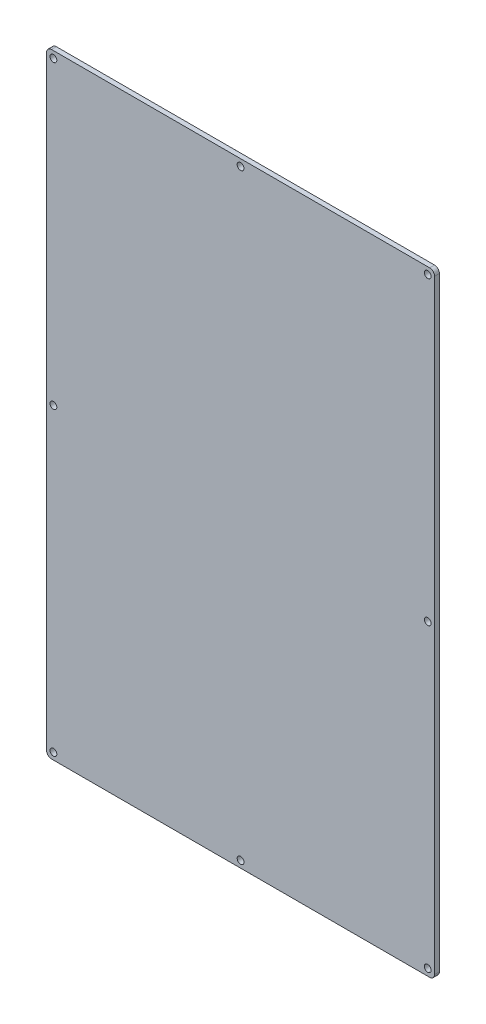
ISO-10303-21;
HEADER;
FILE_DESCRIPTION(('STEP AP214'),'2;1');
FILE_NAME('part.step','',(''),(''),'','','');
FILE_SCHEMA(('AUTOMOTIVE_DESIGN { 1 0 10303 214 1 1 1 1 }'));
ENDSEC;
DATA;
#1=APPLICATION_CONTEXT('core data for automotive mechanical design processes');
#2=APPLICATION_PROTOCOL_DEFINITION('international standard','automotive_design',2000,#1);
#3=PRODUCT_CONTEXT('',#1,'mechanical');
#4=PRODUCT('Part','Part','',(#3));
#5=PRODUCT_RELATED_PRODUCT_CATEGORY('part','',(#4));
#6=PRODUCT_DEFINITION_FORMATION('','',#4);
#7=PRODUCT_DEFINITION_CONTEXT('part definition',#1,'design');
#8=PRODUCT_DEFINITION('design','',#6,#7);
#9=PRODUCT_DEFINITION_SHAPE('','',#8);
#10=(LENGTH_UNIT() NAMED_UNIT(*) SI_UNIT(.MILLI.,.METRE.));
#11=(NAMED_UNIT(*) PLANE_ANGLE_UNIT() SI_UNIT($,.RADIAN.));
#12=(NAMED_UNIT(*) SI_UNIT($,.STERADIAN.) SOLID_ANGLE_UNIT());
#13=UNCERTAINTY_MEASURE_WITH_UNIT(LENGTH_MEASURE(1.E-05),#10,'distance_accuracy_value','');
#14=(GEOMETRIC_REPRESENTATION_CONTEXT(3) GLOBAL_UNCERTAINTY_ASSIGNED_CONTEXT((#13)) GLOBAL_UNIT_ASSIGNED_CONTEXT((#10,
#11,#12)) REPRESENTATION_CONTEXT('',''));
#15=CARTESIAN_POINT('',(0.,0.,0.));
#16=DIRECTION('',(0.,0.,1.));
#17=DIRECTION('',(1.,0.,0.));
#18=AXIS2_PLACEMENT_3D('',#15,#16,#17);
#19=CARTESIAN_POINT('',(0.,0.,2.5));
#20=DIRECTION('',(0.,0.,1.));
#21=DIRECTION('',(1.,0.,0.));
#22=AXIS2_PLACEMENT_3D('',#19,#20,#21);
#23=PLANE('',#22);
#24=CARTESIAN_POINT('',(-192.5,0.,2.5));
#25=DIRECTION('',(0.,0.,1.));
#26=DIRECTION('',(1.,0.,0.));
#27=AXIS2_PLACEMENT_3D('',#24,#25,#26);
#28=CIRCLE('',#27,3.5);
#29=CARTESIAN_POINT('',(-189.,0.,2.5));
#30=VERTEX_POINT('',#29);
#31=EDGE_CURVE('E178',#30,#30,#28,.F.);
#32=ORIENTED_EDGE('',*,*,#31,.T.);
#33=EDGE_LOOP('',(#32));
#34=FACE_BOUND('',#33,.T.);
#35=CARTESIAN_POINT('',(-192.5,-309.,2.5));
#36=DIRECTION('',(0.,0.,1.));
#37=DIRECTION('',(1.,0.,0.));
#38=AXIS2_PLACEMENT_3D('',#35,#36,#37);
#39=CIRCLE('',#38,3.5);
#40=CARTESIAN_POINT('',(-189.,-309.,2.5));
#41=VERTEX_POINT('',#40);
#42=EDGE_CURVE('E180',#41,#41,#39,.F.);
#43=ORIENTED_EDGE('',*,*,#42,.T.);
#44=EDGE_LOOP('',(#43));
#45=FACE_BOUND('',#44,.T.);
#46=CARTESIAN_POINT('',(0.,-309.,2.5));
#47=DIRECTION('',(0.,0.,1.));
#48=DIRECTION('',(1.,0.,0.));
#49=AXIS2_PLACEMENT_3D('',#46,#47,#48);
#50=CIRCLE('',#49,3.49999999999997);
#51=CARTESIAN_POINT('',(3.49999999999999,-309.,2.5));
#52=VERTEX_POINT('',#51);
#53=EDGE_CURVE('E209',#52,#52,#50,.F.);
#54=ORIENTED_EDGE('',*,*,#53,.T.);
#55=EDGE_LOOP('',(#54));
#56=FACE_BOUND('',#55,.T.);
#57=CARTESIAN_POINT('',(192.5,-309.,2.5));
#58=DIRECTION('',(0.,0.,1.));
#59=DIRECTION('',(1.,0.,0.));
#60=AXIS2_PLACEMENT_3D('',#57,#58,#59);
#61=CIRCLE('',#60,3.5);
#62=CARTESIAN_POINT('',(196.,-309.,2.5));
#63=VERTEX_POINT('',#62);
#64=EDGE_CURVE('E203',#63,#63,#61,.F.);
#65=ORIENTED_EDGE('',*,*,#64,.T.);
#66=EDGE_LOOP('',(#65));
#67=FACE_BOUND('',#66,.T.);
#68=CARTESIAN_POINT('',(192.5,0.,2.5));
#69=DIRECTION('',(0.,0.,1.));
#70=DIRECTION('',(1.,0.,0.));
#71=AXIS2_PLACEMENT_3D('',#68,#69,#70);
#72=CIRCLE('',#71,3.5);
#73=CARTESIAN_POINT('',(196.,0.,2.5));
#74=VERTEX_POINT('',#73);
#75=EDGE_CURVE('E197',#74,#74,#72,.F.);
#76=ORIENTED_EDGE('',*,*,#75,.T.);
#77=EDGE_LOOP('',(#76));
#78=FACE_BOUND('',#77,.T.);
#79=CARTESIAN_POINT('',(192.5,309.,2.5));
#80=DIRECTION('',(0.,0.,1.));
#81=DIRECTION('',(1.,0.,0.));
#82=AXIS2_PLACEMENT_3D('',#79,#80,#81);
#83=CIRCLE('',#82,3.5);
#84=CARTESIAN_POINT('',(196.,309.,2.5));
#85=VERTEX_POINT('',#84);
#86=EDGE_CURVE('E191',#85,#85,#83,.F.);
#87=ORIENTED_EDGE('',*,*,#86,.T.);
#88=EDGE_LOOP('',(#87));
#89=FACE_BOUND('',#88,.T.);
#90=CARTESIAN_POINT('',(0.,309.,2.5));
#91=DIRECTION('',(0.,0.,1.));
#92=DIRECTION('',(1.,0.,0.));
#93=AXIS2_PLACEMENT_3D('',#90,#91,#92);
#94=CIRCLE('',#93,3.49999999999997);
#95=CARTESIAN_POINT('',(3.49999999999999,309.,2.5));
#96=VERTEX_POINT('',#95);
#97=EDGE_CURVE('E185',#96,#96,#94,.F.);
#98=ORIENTED_EDGE('',*,*,#97,.T.);
#99=EDGE_LOOP('',(#98));
#100=FACE_BOUND('',#99,.T.);
#101=CARTESIAN_POINT('',(-192.5,309.,2.5));
#102=DIRECTION('',(0.,0.,1.));
#103=DIRECTION('',(1.,0.,0.));
#104=AXIS2_PLACEMENT_3D('',#101,#102,#103);
#105=CIRCLE('',#104,3.5);
#106=CARTESIAN_POINT('',(-189.,309.,2.5));
#107=VERTEX_POINT('',#106);
#108=EDGE_CURVE('E182',#107,#107,#105,.F.);
#109=ORIENTED_EDGE('',*,*,#108,.T.);
#110=EDGE_LOOP('',(#109));
#111=FACE_BOUND('',#110,.T.);
#112=DIRECTION('',(0.,1.,0.));
#113=VECTOR('',#112,1.);
#114=CARTESIAN_POINT('',(-199.5,316.,2.5));
#115=LINE('',#114,#113);
#116=CARTESIAN_POINT('',(-199.5,311.,2.5));
#117=VERTEX_POINT('',#116);
#118=CARTESIAN_POINT('',(-199.5,-311.,2.5));
#119=VERTEX_POINT('',#118);
#120=EDGE_CURVE('E131',#117,#119,#115,.F.);
#121=ORIENTED_EDGE('',*,*,#120,.T.);
#122=CARTESIAN_POINT('',(-194.5,-311.,2.5));
#123=DIRECTION('',(0.,0.,-1.));
#124=DIRECTION('',(-1.,0.,0.));
#125=AXIS2_PLACEMENT_3D('',#122,#123,#124);
#126=CIRCLE('',#125,5.);
#127=CARTESIAN_POINT('',(-194.5,-316.,2.5));
#128=VERTEX_POINT('',#127);
#129=EDGE_CURVE('E120',#128,#119,#126,.T.);
#130=ORIENTED_EDGE('',*,*,#129,.F.);
#131=DIRECTION('',(1.,0.,0.));
#132=VECTOR('',#131,1.);
#133=CARTESIAN_POINT('',(-199.5,-316.,2.5));
#134=LINE('',#133,#132);
#135=CARTESIAN_POINT('',(194.5,-316.,2.5));
#136=VERTEX_POINT('',#135);
#137=EDGE_CURVE('E144',#128,#136,#134,.T.);
#138=ORIENTED_EDGE('',*,*,#137,.T.);
#139=CARTESIAN_POINT('',(194.5,-311.,2.5));
#140=DIRECTION('',(0.,0.,-1.));
#141=DIRECTION('',(-1.,0.,0.));
#142=AXIS2_PLACEMENT_3D('',#139,#140,#141);
#143=CIRCLE('',#142,5.);
#144=CARTESIAN_POINT('',(199.5,-311.,2.5));
#145=VERTEX_POINT('',#144);
#146=EDGE_CURVE('E158',#145,#136,#143,.T.);
#147=ORIENTED_EDGE('',*,*,#146,.F.);
#148=DIRECTION('',(0.,-1.,0.));
#149=VECTOR('',#148,1.);
#150=CARTESIAN_POINT('',(199.5,316.,2.5));
#151=LINE('',#150,#149);
#152=CARTESIAN_POINT('',(199.5,311.,2.5));
#153=VERTEX_POINT('',#152);
#154=EDGE_CURVE('E152',#145,#153,#151,.F.);
#155=ORIENTED_EDGE('',*,*,#154,.T.);
#156=CARTESIAN_POINT('',(194.5,311.,2.5));
#157=DIRECTION('',(0.,0.,-1.));
#158=DIRECTION('',(-1.,0.,0.));
#159=AXIS2_PLACEMENT_3D('',#156,#157,#158);
#160=CIRCLE('',#159,5.);
#161=CARTESIAN_POINT('',(194.5,316.,2.5));
#162=VERTEX_POINT('',#161);
#163=EDGE_CURVE('E155',#162,#153,#160,.T.);
#164=ORIENTED_EDGE('',*,*,#163,.F.);
#165=DIRECTION('',(1.,0.,0.));
#166=VECTOR('',#165,1.);
#167=CARTESIAN_POINT('',(-199.5,316.,2.5));
#168=LINE('',#167,#166);
#169=CARTESIAN_POINT('',(-194.5,316.,2.5));
#170=VERTEX_POINT('',#169);
#171=EDGE_CURVE('E148',#162,#170,#168,.F.);
#172=ORIENTED_EDGE('',*,*,#171,.T.);
#173=CARTESIAN_POINT('',(-194.5,311.,2.5));
#174=DIRECTION('',(0.,0.,-1.));
#175=DIRECTION('',(-1.,0.,0.));
#176=AXIS2_PLACEMENT_3D('',#173,#174,#175);
#177=CIRCLE('',#176,5.);
#178=EDGE_CURVE('E135',#117,#170,#177,.T.);
#179=ORIENTED_EDGE('',*,*,#178,.F.);
#180=EDGE_LOOP('',(#121,#130,#138,#147,#155,#164,#172,#179));
#181=FACE_BOUND('',#180,.T.);
#182=ADVANCED_FACE('F44',(#34,#45,#56,#67,#78,#89,#100,#111,#181),#23,.T.);
#183=CARTESIAN_POINT('',(-199.5,316.,2.5));
#184=DIRECTION('',(1.,0.,0.));
#185=DIRECTION('',(0.,1.,0.));
#186=AXIS2_PLACEMENT_3D('',#183,#184,#185);
#187=PLANE('',#186);
#188=DIRECTION('',(0.,1.,0.));
#189=VECTOR('',#188,1.);
#190=CARTESIAN_POINT('',(-199.5,0.,-2.5));
#191=LINE('',#190,#189);
#192=CARTESIAN_POINT('',(-199.5,311.,-2.5));
#193=VERTEX_POINT('',#192);
#194=CARTESIAN_POINT('',(-199.5,-311.,-2.5));
#195=VERTEX_POINT('',#194);
#196=EDGE_CURVE('E142',#193,#195,#191,.F.);
#197=ORIENTED_EDGE('',*,*,#196,.T.);
#198=DIRECTION('',(0.,0.,-1.));
#199=VECTOR('',#198,1.);
#200=CARTESIAN_POINT('',(-199.5,-311.,2.5));
#201=LINE('',#200,#199);
#202=EDGE_CURVE('E128',#119,#195,#201,.T.);
#203=ORIENTED_EDGE('',*,*,#202,.F.);
#204=ORIENTED_EDGE('',*,*,#120,.F.);
#205=DIRECTION('',(0.,0.,-1.));
#206=VECTOR('',#205,1.);
#207=CARTESIAN_POINT('',(-199.5,311.,2.5));
#208=LINE('',#207,#206);
#209=EDGE_CURVE('E149',#193,#117,#208,.F.);
#210=ORIENTED_EDGE('',*,*,#209,.F.);
#211=EDGE_LOOP('',(#197,#203,#204,#210));
#212=FACE_BOUND('',#211,.T.);
#213=ADVANCED_FACE('F141',(#212),#187,.F.);
#214=CARTESIAN_POINT('',(-194.5,-311.,2.5));
#215=DIRECTION('',(0.,0.,-1.));
#216=DIRECTION('',(-1.,0.,0.));
#217=AXIS2_PLACEMENT_3D('',#214,#215,#216);
#218=CYLINDRICAL_SURFACE('',#217,5.);
#219=ORIENTED_EDGE('',*,*,#129,.T.);
#220=ORIENTED_EDGE('',*,*,#202,.T.);
#221=CARTESIAN_POINT('',(-194.5,-311.,-2.5));
#222=DIRECTION('',(0.,0.,-1.));
#223=DIRECTION('',(-1.,0.,0.));
#224=AXIS2_PLACEMENT_3D('',#221,#222,#223);
#225=CIRCLE('',#224,5.);
#226=CARTESIAN_POINT('',(-194.5,-316.,-2.5));
#227=VERTEX_POINT('',#226);
#228=EDGE_CURVE('E171',#195,#227,#225,.F.);
#229=ORIENTED_EDGE('',*,*,#228,.T.);
#230=DIRECTION('',(0.,0.,1.));
#231=VECTOR('',#230,1.);
#232=CARTESIAN_POINT('',(-194.5,-316.,2.5));
#233=LINE('',#232,#231);
#234=EDGE_CURVE('E130',#227,#128,#233,.T.);
#235=ORIENTED_EDGE('',*,*,#234,.T.);
#236=EDGE_LOOP('',(#219,#220,#229,#235));
#237=FACE_BOUND('',#236,.T.);
#238=ADVANCED_FACE('F125',(#237),#218,.T.);
#239=CARTESIAN_POINT('',(-199.5,-316.,2.5));
#240=DIRECTION('',(0.,1.,0.));
#241=DIRECTION('',(0.,0.,1.));
#242=AXIS2_PLACEMENT_3D('',#239,#240,#241);
#243=PLANE('',#242);
#244=ORIENTED_EDGE('',*,*,#137,.F.);
#245=ORIENTED_EDGE('',*,*,#234,.F.);
#246=DIRECTION('',(1.,0.,0.));
#247=VECTOR('',#246,1.);
#248=CARTESIAN_POINT('',(0.,-316.,-2.5));
#249=LINE('',#248,#247);
#250=CARTESIAN_POINT('',(194.5,-316.,-2.5));
#251=VERTEX_POINT('',#250);
#252=EDGE_CURVE('E170',#227,#251,#249,.T.);
#253=ORIENTED_EDGE('',*,*,#252,.T.);
#254=DIRECTION('',(0.,0.,-1.));
#255=VECTOR('',#254,1.);
#256=CARTESIAN_POINT('',(194.5,-316.,2.5));
#257=LINE('',#256,#255);
#258=EDGE_CURVE('E176',#136,#251,#257,.T.);
#259=ORIENTED_EDGE('',*,*,#258,.F.);
#260=EDGE_LOOP('',(#244,#245,#253,#259));
#261=FACE_BOUND('',#260,.T.);
#262=ADVANCED_FACE('F272',(#261),#243,.F.);
#263=CARTESIAN_POINT('',(194.5,-311.,2.5));
#264=DIRECTION('',(0.,0.,-1.));
#265=DIRECTION('',(-1.,0.,0.));
#266=AXIS2_PLACEMENT_3D('',#263,#264,#265);
#267=CYLINDRICAL_SURFACE('',#266,5.);
#268=ORIENTED_EDGE('',*,*,#146,.T.);
#269=ORIENTED_EDGE('',*,*,#258,.T.);
#270=CARTESIAN_POINT('',(194.5,-311.,-2.5));
#271=DIRECTION('',(0.,0.,-1.));
#272=DIRECTION('',(-1.,0.,0.));
#273=AXIS2_PLACEMENT_3D('',#270,#271,#272);
#274=CIRCLE('',#273,5.);
#275=CARTESIAN_POINT('',(199.5,-311.,-2.5));
#276=VERTEX_POINT('',#275);
#277=EDGE_CURVE('E167',#251,#276,#274,.F.);
#278=ORIENTED_EDGE('',*,*,#277,.T.);
#279=DIRECTION('',(0.,0.,1.));
#280=VECTOR('',#279,1.);
#281=CARTESIAN_POINT('',(199.5,-311.,2.5));
#282=LINE('',#281,#280);
#283=EDGE_CURVE('E156',#276,#145,#282,.T.);
#284=ORIENTED_EDGE('',*,*,#283,.T.);
#285=EDGE_LOOP('',(#268,#269,#278,#284));
#286=FACE_BOUND('',#285,.T.);
#287=ADVANCED_FACE('F268',(#286),#267,.T.);
#288=CARTESIAN_POINT('',(199.5,316.,2.5));
#289=DIRECTION('',(-1.,0.,0.));
#290=DIRECTION('',(0.,-1.,0.));
#291=AXIS2_PLACEMENT_3D('',#288,#289,#290);
#292=PLANE('',#291);
#293=ORIENTED_EDGE('',*,*,#154,.F.);
#294=ORIENTED_EDGE('',*,*,#283,.F.);
#295=DIRECTION('',(0.,1.,0.));
#296=VECTOR('',#295,1.);
#297=CARTESIAN_POINT('',(199.5,0.,-2.5));
#298=LINE('',#297,#296);
#299=CARTESIAN_POINT('',(199.5,311.,-2.5));
#300=VERTEX_POINT('',#299);
#301=EDGE_CURVE('E166',#276,#300,#298,.T.);
#302=ORIENTED_EDGE('',*,*,#301,.T.);
#303=DIRECTION('',(0.,0.,-1.));
#304=VECTOR('',#303,1.);
#305=CARTESIAN_POINT('',(199.5,311.,2.5));
#306=LINE('',#305,#304);
#307=EDGE_CURVE('E175',#153,#300,#306,.T.);
#308=ORIENTED_EDGE('',*,*,#307,.F.);
#309=EDGE_LOOP('',(#293,#294,#302,#308));
#310=FACE_BOUND('',#309,.T.);
#311=ADVANCED_FACE('F287',(#310),#292,.F.);
#312=CARTESIAN_POINT('',(194.5,311.,2.5));
#313=DIRECTION('',(0.,0.,-1.));
#314=DIRECTION('',(-1.,0.,0.));
#315=AXIS2_PLACEMENT_3D('',#312,#313,#314);
#316=CYLINDRICAL_SURFACE('',#315,5.);
#317=ORIENTED_EDGE('',*,*,#163,.T.);
#318=ORIENTED_EDGE('',*,*,#307,.T.);
#319=CARTESIAN_POINT('',(194.5,311.,-2.5));
#320=DIRECTION('',(0.,0.,-1.));
#321=DIRECTION('',(-1.,0.,0.));
#322=AXIS2_PLACEMENT_3D('',#319,#320,#321);
#323=CIRCLE('',#322,5.);
#324=CARTESIAN_POINT('',(194.5,316.,-2.5));
#325=VERTEX_POINT('',#324);
#326=EDGE_CURVE('E163',#300,#325,#323,.F.);
#327=ORIENTED_EDGE('',*,*,#326,.T.);
#328=DIRECTION('',(0.,0.,-1.));
#329=VECTOR('',#328,1.);
#330=CARTESIAN_POINT('',(194.5,316.,2.5));
#331=LINE('',#330,#329);
#332=EDGE_CURVE('E150',#325,#162,#331,.F.);
#333=ORIENTED_EDGE('',*,*,#332,.T.);
#334=EDGE_LOOP('',(#317,#318,#327,#333));
#335=FACE_BOUND('',#334,.T.);
#336=ADVANCED_FACE('F256',(#335),#316,.T.);
#337=CARTESIAN_POINT('',(-199.5,316.,2.5));
#338=DIRECTION('',(0.,-1.,0.));
#339=DIRECTION('',(0.,0.,-1.));
#340=AXIS2_PLACEMENT_3D('',#337,#338,#339);
#341=PLANE('',#340);
#342=ORIENTED_EDGE('',*,*,#171,.F.);
#343=ORIENTED_EDGE('',*,*,#332,.F.);
#344=DIRECTION('',(1.,0.,0.));
#345=VECTOR('',#344,1.);
#346=CARTESIAN_POINT('',(0.,316.,-2.5));
#347=LINE('',#346,#345);
#348=CARTESIAN_POINT('',(-194.5,316.,-2.5));
#349=VERTEX_POINT('',#348);
#350=EDGE_CURVE('E162',#325,#349,#347,.F.);
#351=ORIENTED_EDGE('',*,*,#350,.T.);
#352=DIRECTION('',(0.,0.,-1.));
#353=VECTOR('',#352,1.);
#354=CARTESIAN_POINT('',(-194.5,316.,2.5));
#355=LINE('',#354,#353);
#356=EDGE_CURVE('E62',#170,#349,#355,.T.);
#357=ORIENTED_EDGE('',*,*,#356,.F.);
#358=EDGE_LOOP('',(#342,#343,#351,#357));
#359=FACE_BOUND('',#358,.T.);
#360=ADVANCED_FACE('F279',(#359),#341,.F.);
#361=CARTESIAN_POINT('',(-194.5,311.,2.5));
#362=DIRECTION('',(0.,0.,-1.));
#363=DIRECTION('',(-1.,0.,0.));
#364=AXIS2_PLACEMENT_3D('',#361,#362,#363);
#365=CYLINDRICAL_SURFACE('',#364,5.);
#366=ORIENTED_EDGE('',*,*,#178,.T.);
#367=ORIENTED_EDGE('',*,*,#356,.T.);
#368=CARTESIAN_POINT('',(-194.5,311.,-2.5));
#369=DIRECTION('',(0.,0.,-1.));
#370=DIRECTION('',(-1.,0.,0.));
#371=AXIS2_PLACEMENT_3D('',#368,#369,#370);
#372=CIRCLE('',#371,5.);
#373=EDGE_CURVE('E159',#349,#193,#372,.F.);
#374=ORIENTED_EDGE('',*,*,#373,.T.);
#375=ORIENTED_EDGE('',*,*,#209,.T.);
#376=EDGE_LOOP('',(#366,#367,#374,#375));
#377=FACE_BOUND('',#376,.T.);
#378=ADVANCED_FACE('F277',(#377),#365,.T.);
#379=CARTESIAN_POINT('',(-192.5,309.,-2.5));
#380=DIRECTION('',(0.,0.,1.));
#381=DIRECTION('',(1.,0.,0.));
#382=AXIS2_PLACEMENT_3D('',#379,#380,#381);
#383=CYLINDRICAL_SURFACE('',#382,3.5);
#384=ORIENTED_EDGE('',*,*,#108,.F.);
#385=EDGE_LOOP('',(#384));
#386=FACE_BOUND('',#385,.T.);
#387=CARTESIAN_POINT('',(-192.5,309.,-2.5));
#388=DIRECTION('',(0.,0.,1.));
#389=DIRECTION('',(1.,0.,0.));
#390=AXIS2_PLACEMENT_3D('',#387,#388,#389);
#391=CIRCLE('',#390,3.5);
#392=CARTESIAN_POINT('',(-189.,309.,-2.5));
#393=VERTEX_POINT('',#392);
#394=EDGE_CURVE('E161',#393,#393,#391,.F.);
#395=ORIENTED_EDGE('',*,*,#394,.T.);
#396=EDGE_LOOP('',(#395));
#397=FACE_BOUND('',#396,.T.);
#398=ADVANCED_FACE('F46',(#386,#397),#383,.F.);
#399=CARTESIAN_POINT('',(0.,309.,-2.5));
#400=DIRECTION('',(0.,0.,1.));
#401=DIRECTION('',(1.,0.,0.));
#402=AXIS2_PLACEMENT_3D('',#399,#400,#401);
#403=CYLINDRICAL_SURFACE('',#402,3.49999999999997);
#404=ORIENTED_EDGE('',*,*,#97,.F.);
#405=EDGE_LOOP('',(#404));
#406=FACE_BOUND('',#405,.T.);
#407=CARTESIAN_POINT('',(0.,309.,-2.5));
#408=DIRECTION('',(0.,0.,1.));
#409=DIRECTION('',(1.,0.,0.));
#410=AXIS2_PLACEMENT_3D('',#407,#408,#409);
#411=CIRCLE('',#410,3.49999999999997);
#412=CARTESIAN_POINT('',(3.49999999999999,309.,-2.5));
#413=VERTEX_POINT('',#412);
#414=EDGE_CURVE('E188',#413,#413,#411,.F.);
#415=ORIENTED_EDGE('',*,*,#414,.T.);
#416=EDGE_LOOP('',(#415));
#417=FACE_BOUND('',#416,.T.);
#418=ADVANCED_FACE('F319',(#406,#417),#403,.F.);
#419=CARTESIAN_POINT('',(192.5,309.,-2.5));
#420=DIRECTION('',(0.,0.,1.));
#421=DIRECTION('',(1.,0.,0.));
#422=AXIS2_PLACEMENT_3D('',#419,#420,#421);
#423=CYLINDRICAL_SURFACE('',#422,3.5);
#424=ORIENTED_EDGE('',*,*,#86,.F.);
#425=EDGE_LOOP('',(#424));
#426=FACE_BOUND('',#425,.T.);
#427=CARTESIAN_POINT('',(192.5,309.,-2.5));
#428=DIRECTION('',(0.,0.,1.));
#429=DIRECTION('',(1.,0.,0.));
#430=AXIS2_PLACEMENT_3D('',#427,#428,#429);
#431=CIRCLE('',#430,3.5);
#432=CARTESIAN_POINT('',(196.,309.,-2.5));
#433=VERTEX_POINT('',#432);
#434=EDGE_CURVE('E194',#433,#433,#431,.F.);
#435=ORIENTED_EDGE('',*,*,#434,.T.);
#436=EDGE_LOOP('',(#435));
#437=FACE_BOUND('',#436,.T.);
#438=ADVANCED_FACE('F316',(#426,#437),#423,.F.);
#439=CARTESIAN_POINT('',(192.5,0.,-2.5));
#440=DIRECTION('',(0.,0.,1.));
#441=DIRECTION('',(1.,0.,0.));
#442=AXIS2_PLACEMENT_3D('',#439,#440,#441);
#443=CYLINDRICAL_SURFACE('',#442,3.5);
#444=ORIENTED_EDGE('',*,*,#75,.F.);
#445=EDGE_LOOP('',(#444));
#446=FACE_BOUND('',#445,.T.);
#447=CARTESIAN_POINT('',(192.5,0.,-2.5));
#448=DIRECTION('',(0.,0.,1.));
#449=DIRECTION('',(1.,0.,0.));
#450=AXIS2_PLACEMENT_3D('',#447,#448,#449);
#451=CIRCLE('',#450,3.5);
#452=CARTESIAN_POINT('',(196.,0.,-2.5));
#453=VERTEX_POINT('',#452);
#454=EDGE_CURVE('E200',#453,#453,#451,.F.);
#455=ORIENTED_EDGE('',*,*,#454,.T.);
#456=EDGE_LOOP('',(#455));
#457=FACE_BOUND('',#456,.T.);
#458=ADVANCED_FACE('F312',(#446,#457),#443,.F.);
#459=CARTESIAN_POINT('',(192.5,-309.,-2.5));
#460=DIRECTION('',(0.,0.,1.));
#461=DIRECTION('',(1.,0.,0.));
#462=AXIS2_PLACEMENT_3D('',#459,#460,#461);
#463=CYLINDRICAL_SURFACE('',#462,3.5);
#464=ORIENTED_EDGE('',*,*,#64,.F.);
#465=EDGE_LOOP('',(#464));
#466=FACE_BOUND('',#465,.T.);
#467=CARTESIAN_POINT('',(192.5,-309.,-2.5));
#468=DIRECTION('',(0.,0.,1.));
#469=DIRECTION('',(1.,0.,0.));
#470=AXIS2_PLACEMENT_3D('',#467,#468,#469);
#471=CIRCLE('',#470,3.5);
#472=CARTESIAN_POINT('',(196.,-309.,-2.5));
#473=VERTEX_POINT('',#472);
#474=EDGE_CURVE('E206',#473,#473,#471,.F.);
#475=ORIENTED_EDGE('',*,*,#474,.T.);
#476=EDGE_LOOP('',(#475));
#477=FACE_BOUND('',#476,.T.);
#478=ADVANCED_FACE('F308',(#466,#477),#463,.F.);
#479=CARTESIAN_POINT('',(0.,-309.,-2.5));
#480=DIRECTION('',(0.,0.,1.));
#481=DIRECTION('',(1.,0.,0.));
#482=AXIS2_PLACEMENT_3D('',#479,#480,#481);
#483=CYLINDRICAL_SURFACE('',#482,3.49999999999997);
#484=ORIENTED_EDGE('',*,*,#53,.F.);
#485=EDGE_LOOP('',(#484));
#486=FACE_BOUND('',#485,.T.);
#487=CARTESIAN_POINT('',(0.,-309.,-2.5));
#488=DIRECTION('',(0.,0.,1.));
#489=DIRECTION('',(1.,0.,0.));
#490=AXIS2_PLACEMENT_3D('',#487,#488,#489);
#491=CIRCLE('',#490,3.49999999999997);
#492=CARTESIAN_POINT('',(3.49999999999999,-309.,-2.5));
#493=VERTEX_POINT('',#492);
#494=EDGE_CURVE('E212',#493,#493,#491,.F.);
#495=ORIENTED_EDGE('',*,*,#494,.T.);
#496=EDGE_LOOP('',(#495));
#497=FACE_BOUND('',#496,.T.);
#498=ADVANCED_FACE('F225',(#486,#497),#483,.F.);
#499=CARTESIAN_POINT('',(-192.5,-309.,-2.5));
#500=DIRECTION('',(0.,0.,1.));
#501=DIRECTION('',(1.,0.,0.));
#502=AXIS2_PLACEMENT_3D('',#499,#500,#501);
#503=CYLINDRICAL_SURFACE('',#502,3.5);
#504=ORIENTED_EDGE('',*,*,#42,.F.);
#505=EDGE_LOOP('',(#504));
#506=FACE_BOUND('',#505,.T.);
#507=CARTESIAN_POINT('',(-192.5,-309.,-2.5));
#508=DIRECTION('',(0.,0.,1.));
#509=DIRECTION('',(1.,0.,0.));
#510=AXIS2_PLACEMENT_3D('',#507,#508,#509);
#511=CIRCLE('',#510,3.5);
#512=CARTESIAN_POINT('',(-189.,-309.,-2.5));
#513=VERTEX_POINT('',#512);
#514=EDGE_CURVE('E48',#513,#513,#511,.F.);
#515=ORIENTED_EDGE('',*,*,#514,.T.);
#516=EDGE_LOOP('',(#515));
#517=FACE_BOUND('',#516,.T.);
#518=ADVANCED_FACE('F221',(#506,#517),#503,.F.);
#519=CARTESIAN_POINT('',(-192.5,0.,-2.5));
#520=DIRECTION('',(0.,0.,1.));
#521=DIRECTION('',(1.,0.,0.));
#522=AXIS2_PLACEMENT_3D('',#519,#520,#521);
#523=CYLINDRICAL_SURFACE('',#522,3.5);
#524=ORIENTED_EDGE('',*,*,#31,.F.);
#525=EDGE_LOOP('',(#524));
#526=FACE_BOUND('',#525,.T.);
#527=CARTESIAN_POINT('',(-192.5,0.,-2.5));
#528=DIRECTION('',(0.,0.,1.));
#529=DIRECTION('',(1.,0.,0.));
#530=AXIS2_PLACEMENT_3D('',#527,#528,#529);
#531=CIRCLE('',#530,3.5);
#532=CARTESIAN_POINT('',(-189.,0.,-2.5));
#533=VERTEX_POINT('',#532);
#534=EDGE_CURVE('E11',#533,#533,#531,.F.);
#535=ORIENTED_EDGE('',*,*,#534,.T.);
#536=EDGE_LOOP('',(#535));
#537=FACE_BOUND('',#536,.T.);
#538=ADVANCED_FACE('F224',(#526,#537),#523,.F.);
#539=CARTESIAN_POINT('',(0.,0.,-2.5));
#540=DIRECTION('',(0.,0.,1.));
#541=DIRECTION('',(1.,0.,0.));
#542=AXIS2_PLACEMENT_3D('',#539,#540,#541);
#543=PLANE('',#542);
#544=ORIENTED_EDGE('',*,*,#534,.F.);
#545=EDGE_LOOP('',(#544));
#546=FACE_BOUND('',#545,.T.);
#547=ORIENTED_EDGE('',*,*,#514,.F.);
#548=EDGE_LOOP('',(#547));
#549=FACE_BOUND('',#548,.T.);
#550=ORIENTED_EDGE('',*,*,#494,.F.);
#551=EDGE_LOOP('',(#550));
#552=FACE_BOUND('',#551,.T.);
#553=ORIENTED_EDGE('',*,*,#474,.F.);
#554=EDGE_LOOP('',(#553));
#555=FACE_BOUND('',#554,.T.);
#556=ORIENTED_EDGE('',*,*,#454,.F.);
#557=EDGE_LOOP('',(#556));
#558=FACE_BOUND('',#557,.T.);
#559=ORIENTED_EDGE('',*,*,#434,.F.);
#560=EDGE_LOOP('',(#559));
#561=FACE_BOUND('',#560,.T.);
#562=ORIENTED_EDGE('',*,*,#414,.F.);
#563=EDGE_LOOP('',(#562));
#564=FACE_BOUND('',#563,.T.);
#565=ORIENTED_EDGE('',*,*,#394,.F.);
#566=EDGE_LOOP('',(#565));
#567=FACE_BOUND('',#566,.T.);
#568=ORIENTED_EDGE('',*,*,#350,.F.);
#569=ORIENTED_EDGE('',*,*,#326,.F.);
#570=ORIENTED_EDGE('',*,*,#301,.F.);
#571=ORIENTED_EDGE('',*,*,#277,.F.);
#572=ORIENTED_EDGE('',*,*,#252,.F.);
#573=ORIENTED_EDGE('',*,*,#228,.F.);
#574=ORIENTED_EDGE('',*,*,#196,.F.);
#575=ORIENTED_EDGE('',*,*,#373,.F.);
#576=EDGE_LOOP('',(#568,#569,#570,#571,#572,#573,#574,#575));
#577=FACE_BOUND('',#576,.T.);
#578=ADVANCED_FACE('F230',(#546,#549,#552,#555,#558,#561,#564,#567,#577),#543,.F.);
#579=CLOSED_SHELL('',(#182,#213,#238,#262,#287,#311,#336,#360,#378,#398,#418,#438,#458,#478,
#498,#518,#538,#578));
#580=MANIFOLD_SOLID_BREP('B2',#579);
#581=ADVANCED_BREP_SHAPE_REPRESENTATION('',(#18,#580),#14);
#582=SHAPE_DEFINITION_REPRESENTATION(#9,#581);
ENDSEC;
END-ISO-10303-21;
